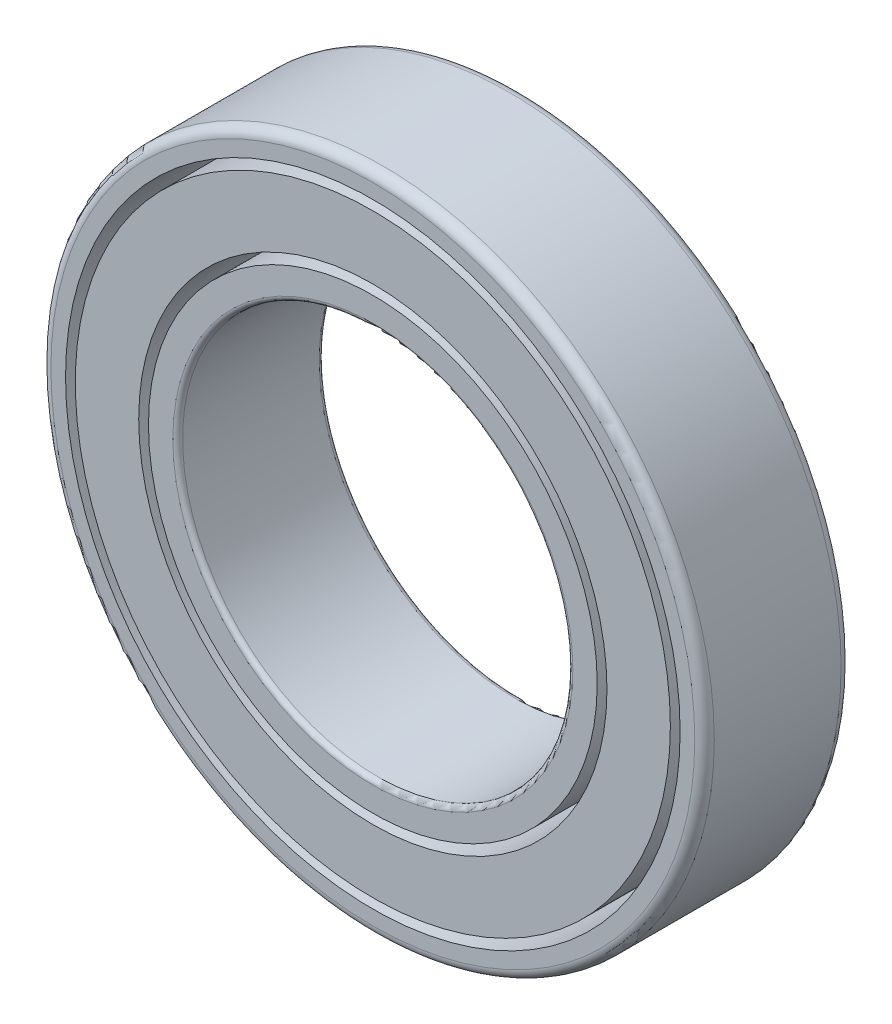
ISO-10303-21;
HEADER;
FILE_DESCRIPTION(('STEP AP214'),'2;1');
FILE_NAME('part.step','',(''),(''),'','','');
FILE_SCHEMA(('AUTOMOTIVE_DESIGN { 1 0 10303 214 1 1 1 1 }'));
ENDSEC;
DATA;
#1=APPLICATION_CONTEXT('core data for automotive mechanical design processes');
#2=APPLICATION_PROTOCOL_DEFINITION('international standard','automotive_design',2000,#1);
#3=PRODUCT_CONTEXT('',#1,'mechanical');
#4=PRODUCT('Part','Part','',(#3));
#5=PRODUCT_RELATED_PRODUCT_CATEGORY('part','',(#4));
#6=PRODUCT_DEFINITION_FORMATION('','',#4);
#7=PRODUCT_DEFINITION_CONTEXT('part definition',#1,'design');
#8=PRODUCT_DEFINITION('design','',#6,#7);
#9=PRODUCT_DEFINITION_SHAPE('','',#8);
#10=(LENGTH_UNIT() NAMED_UNIT(*) SI_UNIT(.MILLI.,.METRE.));
#11=(NAMED_UNIT(*) PLANE_ANGLE_UNIT() SI_UNIT($,.RADIAN.));
#12=(NAMED_UNIT(*) SI_UNIT($,.STERADIAN.) SOLID_ANGLE_UNIT());
#13=UNCERTAINTY_MEASURE_WITH_UNIT(LENGTH_MEASURE(1.E-05),#10,'distance_accuracy_value','');
#14=(GEOMETRIC_REPRESENTATION_CONTEXT(3) GLOBAL_UNCERTAINTY_ASSIGNED_CONTEXT((#13)) GLOBAL_UNIT_ASSIGNED_CONTEXT((#10,
#11,#12)) REPRESENTATION_CONTEXT('',''));
#15=CARTESIAN_POINT('',(0.,0.,0.));
#16=DIRECTION('',(0.,0.,1.));
#17=DIRECTION('',(1.,0.,0.));
#18=AXIS2_PLACEMENT_3D('',#15,#16,#17);
#19=CARTESIAN_POINT('',(0.,0.,7.5));
#20=DIRECTION('',(0.,0.,1.));
#21=DIRECTION('',(1.,0.,0.));
#22=AXIS2_PLACEMENT_3D('',#19,#20,#21);
#23=PLANE('',#22);
#24=CARTESIAN_POINT('',(0.,0.,7.5));
#25=DIRECTION('',(0.,0.,1.));
#26=DIRECTION('',(1.,0.,0.));
#27=AXIS2_PLACEMENT_3D('',#24,#25,#26);
#28=CIRCLE('',#27,33.);
#29=CARTESIAN_POINT('',(33.,0.,7.5));
#30=VERTEX_POINT('',#29);
#31=EDGE_CURVE('E12',#30,#30,#28,.T.);
#32=ORIENTED_EDGE('',*,*,#31,.T.);
#33=EDGE_LOOP('',(#32));
#34=FACE_BOUND('',#33,.T.);
#35=CARTESIAN_POINT('',(0.,0.,7.5));
#36=DIRECTION('',(0.,0.,1.));
#37=DIRECTION('',(1.,0.,0.));
#38=AXIS2_PLACEMENT_3D('',#35,#36,#37);
#39=CIRCLE('',#38,31.5);
#40=CARTESIAN_POINT('',(31.5,0.,7.5));
#41=VERTEX_POINT('',#40);
#42=EDGE_CURVE('E111',#41,#41,#39,.T.);
#43=ORIENTED_EDGE('',*,*,#42,.F.);
#44=EDGE_LOOP('',(#43));
#45=FACE_BOUND('',#44,.T.);
#46=ADVANCED_FACE('F90',(#34,#45),#23,.T.);
#47=CARTESIAN_POINT('',(0.,0.,-7.5));
#48=DIRECTION('',(0.,0.,1.));
#49=DIRECTION('',(1.,0.,0.));
#50=AXIS2_PLACEMENT_3D('',#47,#48,#49);
#51=PLANE('',#50);
#52=CARTESIAN_POINT('',(0.,0.,-7.5));
#53=DIRECTION('',(0.,0.,1.));
#54=DIRECTION('',(1.,0.,0.));
#55=AXIS2_PLACEMENT_3D('',#52,#53,#54);
#56=CIRCLE('',#55,33.);
#57=CARTESIAN_POINT('',(33.,0.,-7.5));
#58=VERTEX_POINT('',#57);
#59=EDGE_CURVE('E97',#58,#58,#56,.F.);
#60=ORIENTED_EDGE('',*,*,#59,.T.);
#61=EDGE_LOOP('',(#60));
#62=FACE_BOUND('',#61,.T.);
#63=CARTESIAN_POINT('',(0.,0.,-7.5));
#64=DIRECTION('',(0.,0.,1.));
#65=DIRECTION('',(1.,0.,0.));
#66=AXIS2_PLACEMENT_3D('',#63,#64,#65);
#67=CIRCLE('',#66,31.5);
#68=CARTESIAN_POINT('',(31.5,0.,-7.5));
#69=VERTEX_POINT('',#68);
#70=EDGE_CURVE('E110',#69,#69,#67,.T.);
#71=ORIENTED_EDGE('',*,*,#70,.T.);
#72=EDGE_LOOP('',(#71));
#73=FACE_BOUND('',#72,.T.);
#74=ADVANCED_FACE('F117',(#62,#73),#51,.F.);
#75=CARTESIAN_POINT('',(0.,0.,7.5));
#76=DIRECTION('',(0.,0.,-1.));
#77=DIRECTION('',(-1.,0.,0.));
#78=AXIS2_PLACEMENT_3D('',#75,#76,#77);
#79=CYLINDRICAL_SURFACE('',#78,34.);
#80=CARTESIAN_POINT('',(0.,0.,-6.5));
#81=DIRECTION('',(0.,0.,1.));
#82=DIRECTION('',(1.,0.,0.));
#83=AXIS2_PLACEMENT_3D('',#80,#81,#82);
#84=CIRCLE('',#83,34.);
#85=CARTESIAN_POINT('',(34.,0.,-6.5));
#86=VERTEX_POINT('',#85);
#87=EDGE_CURVE('E101',#86,#86,#84,.T.);
#88=ORIENTED_EDGE('',*,*,#87,.T.);
#89=EDGE_LOOP('',(#88));
#90=FACE_BOUND('',#89,.T.);
#91=CARTESIAN_POINT('',(0.,0.,6.5));
#92=DIRECTION('',(0.,0.,1.));
#93=DIRECTION('',(1.,0.,0.));
#94=AXIS2_PLACEMENT_3D('',#91,#92,#93);
#95=CIRCLE('',#94,34.);
#96=CARTESIAN_POINT('',(34.,0.,6.5));
#97=VERTEX_POINT('',#96);
#98=EDGE_CURVE('E105',#97,#97,#95,.F.);
#99=ORIENTED_EDGE('',*,*,#98,.T.);
#100=EDGE_LOOP('',(#99));
#101=FACE_BOUND('',#100,.T.);
#102=ADVANCED_FACE('F122',(#90,#101),#79,.T.);
#103=CARTESIAN_POINT('',(0.,0.,7.5));
#104=DIRECTION('',(0.,0.,-1.));
#105=DIRECTION('',(-1.,0.,0.));
#106=AXIS2_PLACEMENT_3D('',#103,#104,#105);
#107=CYLINDRICAL_SURFACE('',#106,31.5);
#108=ORIENTED_EDGE('',*,*,#42,.T.);
#109=EDGE_LOOP('',(#108));
#110=FACE_BOUND('',#109,.T.);
#111=ORIENTED_EDGE('',*,*,#70,.F.);
#112=EDGE_LOOP('',(#111));
#113=FACE_BOUND('',#112,.T.);
#114=ADVANCED_FACE('F119',(#110,#113),#107,.F.);
#115=CARTESIAN_POINT('',(0.,0.,-6.5));
#116=DIRECTION('',(0.,0.,1.));
#117=DIRECTION('',(1.,0.,0.));
#118=AXIS2_PLACEMENT_3D('',#115,#116,#117);
#119=TOROIDAL_SURFACE('',#118,33.,1.);
#120=ORIENTED_EDGE('',*,*,#59,.F.);
#121=EDGE_LOOP('',(#120));
#122=FACE_BOUND('',#121,.T.);
#123=ORIENTED_EDGE('',*,*,#87,.F.);
#124=EDGE_LOOP('',(#123));
#125=FACE_BOUND('',#124,.T.);
#126=ADVANCED_FACE('F121',(#122,#125),#119,.T.);
#127=CARTESIAN_POINT('',(0.,0.,6.5));
#128=DIRECTION('',(0.,0.,1.));
#129=DIRECTION('',(1.,0.,0.));
#130=AXIS2_PLACEMENT_3D('',#127,#128,#129);
#131=TOROIDAL_SURFACE('',#130,33.,1.);
#132=ORIENTED_EDGE('',*,*,#98,.F.);
#133=EDGE_LOOP('',(#132));
#134=FACE_BOUND('',#133,.T.);
#135=ORIENTED_EDGE('',*,*,#31,.F.);
#136=EDGE_LOOP('',(#135));
#137=FACE_BOUND('',#136,.T.);
#138=ADVANCED_FACE('F92',(#134,#137),#131,.T.);
#139=CLOSED_SHELL('',(#46,#74,#102,#114,#126,#138));
#140=MANIFOLD_SOLID_BREP('B2',#139);
#141=CARTESIAN_POINT('',(0.,0.,7.5));
#142=DIRECTION('',(0.,0.,-1.));
#143=DIRECTION('',(-1.,0.,0.));
#144=AXIS2_PLACEMENT_3D('',#141,#142,#143);
#145=CYLINDRICAL_SURFACE('',#144,20.);
#146=CARTESIAN_POINT('',(0.,0.,-7.));
#147=DIRECTION('',(0.,0.,1.));
#148=DIRECTION('',(1.,0.,0.));
#149=AXIS2_PLACEMENT_3D('',#146,#147,#148);
#150=CIRCLE('',#149,20.);
#151=CARTESIAN_POINT('',(20.,0.,-7.));
#152=VERTEX_POINT('',#151);
#153=EDGE_CURVE('E196',#152,#152,#150,.F.);
#154=ORIENTED_EDGE('',*,*,#153,.T.);
#155=EDGE_LOOP('',(#154));
#156=FACE_BOUND('',#155,.T.);
#157=CARTESIAN_POINT('',(0.,0.,7.));
#158=DIRECTION('',(0.,0.,1.));
#159=DIRECTION('',(1.,0.,0.));
#160=AXIS2_PLACEMENT_3D('',#157,#158,#159);
#161=CIRCLE('',#160,20.);
#162=CARTESIAN_POINT('',(20.,0.,7.));
#163=VERTEX_POINT('',#162);
#164=EDGE_CURVE('E200',#163,#163,#161,.T.);
#165=ORIENTED_EDGE('',*,*,#164,.T.);
#166=EDGE_LOOP('',(#165));
#167=FACE_BOUND('',#166,.T.);
#168=ADVANCED_FACE('F189',(#156,#167),#145,.F.);
#169=CARTESIAN_POINT('',(0.,0.,7.5));
#170=DIRECTION('',(0.,0.,-1.));
#171=DIRECTION('',(-1.,0.,0.));
#172=AXIS2_PLACEMENT_3D('',#169,#170,#171);
#173=CYLINDRICAL_SURFACE('',#172,23.);
#174=CARTESIAN_POINT('',(0.,0.,7.5));
#175=DIRECTION('',(0.,0.,1.));
#176=DIRECTION('',(1.,0.,0.));
#177=AXIS2_PLACEMENT_3D('',#174,#175,#176);
#178=CIRCLE('',#177,23.);
#179=CARTESIAN_POINT('',(23.,0.,7.5));
#180=VERTEX_POINT('',#179);
#181=EDGE_CURVE('E210',#180,#180,#178,.T.);
#182=ORIENTED_EDGE('',*,*,#181,.F.);
#183=EDGE_LOOP('',(#182));
#184=FACE_BOUND('',#183,.T.);
#185=CARTESIAN_POINT('',(0.,0.,-7.5));
#186=DIRECTION('',(0.,0.,1.));
#187=DIRECTION('',(1.,0.,0.));
#188=AXIS2_PLACEMENT_3D('',#185,#186,#187);
#189=CIRCLE('',#188,23.);
#190=CARTESIAN_POINT('',(23.,0.,-7.5));
#191=VERTEX_POINT('',#190);
#192=EDGE_CURVE('E209',#191,#191,#189,.T.);
#193=ORIENTED_EDGE('',*,*,#192,.T.);
#194=EDGE_LOOP('',(#193));
#195=FACE_BOUND('',#194,.T.);
#196=ADVANCED_FACE('F216',(#184,#195),#173,.T.);
#197=CARTESIAN_POINT('',(0.,0.,7.5));
#198=DIRECTION('',(0.,0.,1.));
#199=DIRECTION('',(1.,0.,0.));
#200=AXIS2_PLACEMENT_3D('',#197,#198,#199);
#201=PLANE('',#200);
#202=CARTESIAN_POINT('',(0.,0.,7.5));
#203=DIRECTION('',(0.,0.,1.));
#204=DIRECTION('',(1.,0.,0.));
#205=AXIS2_PLACEMENT_3D('',#202,#203,#204);
#206=CIRCLE('',#205,20.5);
#207=CARTESIAN_POINT('',(20.5,0.,7.5));
#208=VERTEX_POINT('',#207);
#209=EDGE_CURVE('E89',#208,#208,#206,.F.);
#210=ORIENTED_EDGE('',*,*,#209,.T.);
#211=EDGE_LOOP('',(#210));
#212=FACE_BOUND('',#211,.T.);
#213=ORIENTED_EDGE('',*,*,#181,.T.);
#214=EDGE_LOOP('',(#213));
#215=FACE_BOUND('',#214,.T.);
#216=ADVANCED_FACE('F221',(#212,#215),#201,.T.);
#217=CARTESIAN_POINT('',(0.,0.,-7.5));
#218=DIRECTION('',(0.,0.,1.));
#219=DIRECTION('',(1.,0.,0.));
#220=AXIS2_PLACEMENT_3D('',#217,#218,#219);
#221=PLANE('',#220);
#222=CARTESIAN_POINT('',(0.,0.,-7.5));
#223=DIRECTION('',(0.,0.,1.));
#224=DIRECTION('',(1.,0.,0.));
#225=AXIS2_PLACEMENT_3D('',#222,#223,#224);
#226=CIRCLE('',#225,20.5);
#227=CARTESIAN_POINT('',(20.5,0.,-7.5));
#228=VERTEX_POINT('',#227);
#229=EDGE_CURVE('E204',#228,#228,#226,.T.);
#230=ORIENTED_EDGE('',*,*,#229,.T.);
#231=EDGE_LOOP('',(#230));
#232=FACE_BOUND('',#231,.T.);
#233=ORIENTED_EDGE('',*,*,#192,.F.);
#234=EDGE_LOOP('',(#233));
#235=FACE_BOUND('',#234,.T.);
#236=ADVANCED_FACE('F218',(#232,#235),#221,.F.);
#237=CARTESIAN_POINT('',(0.,0.,-7.));
#238=DIRECTION('',(0.,0.,1.));
#239=DIRECTION('',(1.,0.,0.));
#240=AXIS2_PLACEMENT_3D('',#237,#238,#239);
#241=TOROIDAL_SURFACE('',#240,20.5,0.5);
#242=ORIENTED_EDGE('',*,*,#153,.F.);
#243=EDGE_LOOP('',(#242));
#244=FACE_BOUND('',#243,.T.);
#245=ORIENTED_EDGE('',*,*,#229,.F.);
#246=EDGE_LOOP('',(#245));
#247=FACE_BOUND('',#246,.T.);
#248=ADVANCED_FACE('F220',(#244,#247),#241,.T.);
#249=CARTESIAN_POINT('',(0.,0.,7.));
#250=DIRECTION('',(0.,0.,1.));
#251=DIRECTION('',(1.,0.,0.));
#252=AXIS2_PLACEMENT_3D('',#249,#250,#251);
#253=TOROIDAL_SURFACE('',#252,20.5,0.5);
#254=ORIENTED_EDGE('',*,*,#209,.F.);
#255=EDGE_LOOP('',(#254));
#256=FACE_BOUND('',#255,.T.);
#257=ORIENTED_EDGE('',*,*,#164,.F.);
#258=EDGE_LOOP('',(#257));
#259=FACE_BOUND('',#258,.T.);
#260=ADVANCED_FACE('F191',(#256,#259),#253,.T.);
#261=CLOSED_SHELL('',(#168,#196,#216,#236,#248,#260));
#262=MANIFOLD_SOLID_BREP('B7',#261);
#263=CARTESIAN_POINT('',(0.,0.,7.5));
#264=DIRECTION('',(0.,0.,-1.));
#265=DIRECTION('',(-1.,0.,0.));
#266=AXIS2_PLACEMENT_3D('',#263,#264,#265);
#267=CYLINDRICAL_SURFACE('',#266,24.);
#268=CARTESIAN_POINT('',(0.,0.,7.5));
#269=DIRECTION('',(0.,0.,1.));
#270=DIRECTION('',(1.,0.,0.));
#271=AXIS2_PLACEMENT_3D('',#268,#269,#270);
#272=CIRCLE('',#271,24.);
#273=CARTESIAN_POINT('',(24.,0.,7.5));
#274=VERTEX_POINT('',#273);
#275=EDGE_CURVE('E288',#274,#274,#272,.T.);
#276=ORIENTED_EDGE('',*,*,#275,.T.);
#277=EDGE_LOOP('',(#276));
#278=FACE_BOUND('',#277,.T.);
#279=CARTESIAN_POINT('',(0.,0.,-7.5));
#280=DIRECTION('',(0.,0.,1.));
#281=DIRECTION('',(1.,0.,0.));
#282=AXIS2_PLACEMENT_3D('',#279,#280,#281);
#283=CIRCLE('',#282,24.);
#284=CARTESIAN_POINT('',(24.,0.,-7.5));
#285=VERTEX_POINT('',#284);
#286=EDGE_CURVE('E294',#285,#285,#283,.T.);
#287=ORIENTED_EDGE('',*,*,#286,.F.);
#288=EDGE_LOOP('',(#287));
#289=FACE_BOUND('',#288,.T.);
#290=ADVANCED_FACE('F281',(#278,#289),#267,.F.);
#291=CARTESIAN_POINT('',(0.,0.,7.5));
#292=DIRECTION('',(0.,0.,-1.));
#293=DIRECTION('',(-1.,0.,0.));
#294=AXIS2_PLACEMENT_3D('',#291,#292,#293);
#295=CYLINDRICAL_SURFACE('',#294,30.5);
#296=CARTESIAN_POINT('',(0.,0.,7.5));
#297=DIRECTION('',(0.,0.,1.));
#298=DIRECTION('',(1.,0.,0.));
#299=AXIS2_PLACEMENT_3D('',#296,#297,#298);
#300=CIRCLE('',#299,30.5);
#301=CARTESIAN_POINT('',(30.5,0.,7.5));
#302=VERTEX_POINT('',#301);
#303=EDGE_CURVE('E188',#302,#302,#300,.T.);
#304=ORIENTED_EDGE('',*,*,#303,.F.);
#305=EDGE_LOOP('',(#304));
#306=FACE_BOUND('',#305,.T.);
#307=CARTESIAN_POINT('',(0.,0.,-7.5));
#308=DIRECTION('',(0.,0.,1.));
#309=DIRECTION('',(1.,0.,0.));
#310=AXIS2_PLACEMENT_3D('',#307,#308,#309);
#311=CIRCLE('',#310,30.5);
#312=CARTESIAN_POINT('',(30.5,0.,-7.5));
#313=VERTEX_POINT('',#312);
#314=EDGE_CURVE('E284',#313,#313,#311,.T.);
#315=ORIENTED_EDGE('',*,*,#314,.T.);
#316=EDGE_LOOP('',(#315));
#317=FACE_BOUND('',#316,.T.);
#318=ADVANCED_FACE('F301',(#306,#317),#295,.T.);
#319=CARTESIAN_POINT('',(0.,0.,7.5));
#320=DIRECTION('',(0.,0.,1.));
#321=DIRECTION('',(1.,0.,0.));
#322=AXIS2_PLACEMENT_3D('',#319,#320,#321);
#323=PLANE('',#322);
#324=ORIENTED_EDGE('',*,*,#275,.F.);
#325=EDGE_LOOP('',(#324));
#326=FACE_BOUND('',#325,.T.);
#327=ORIENTED_EDGE('',*,*,#303,.T.);
#328=EDGE_LOOP('',(#327));
#329=FACE_BOUND('',#328,.T.);
#330=ADVANCED_FACE('F305',(#326,#329),#323,.T.);
#331=CARTESIAN_POINT('',(0.,0.,-7.5));
#332=DIRECTION('',(0.,0.,1.));
#333=DIRECTION('',(1.,0.,0.));
#334=AXIS2_PLACEMENT_3D('',#331,#332,#333);
#335=PLANE('',#334);
#336=ORIENTED_EDGE('',*,*,#286,.T.);
#337=EDGE_LOOP('',(#336));
#338=FACE_BOUND('',#337,.T.);
#339=ORIENTED_EDGE('',*,*,#314,.F.);
#340=EDGE_LOOP('',(#339));
#341=FACE_BOUND('',#340,.T.);
#342=ADVANCED_FACE('F303',(#338,#341),#335,.F.);
#343=CLOSED_SHELL('',(#290,#318,#330,#342));
#344=MANIFOLD_SOLID_BREP('B84',#343);
#345=ADVANCED_BREP_SHAPE_REPRESENTATION('',(#18,#140,#262,#344),#14);
#346=SHAPE_DEFINITION_REPRESENTATION(#9,#345);
ENDSEC;
END-ISO-10303-21;
